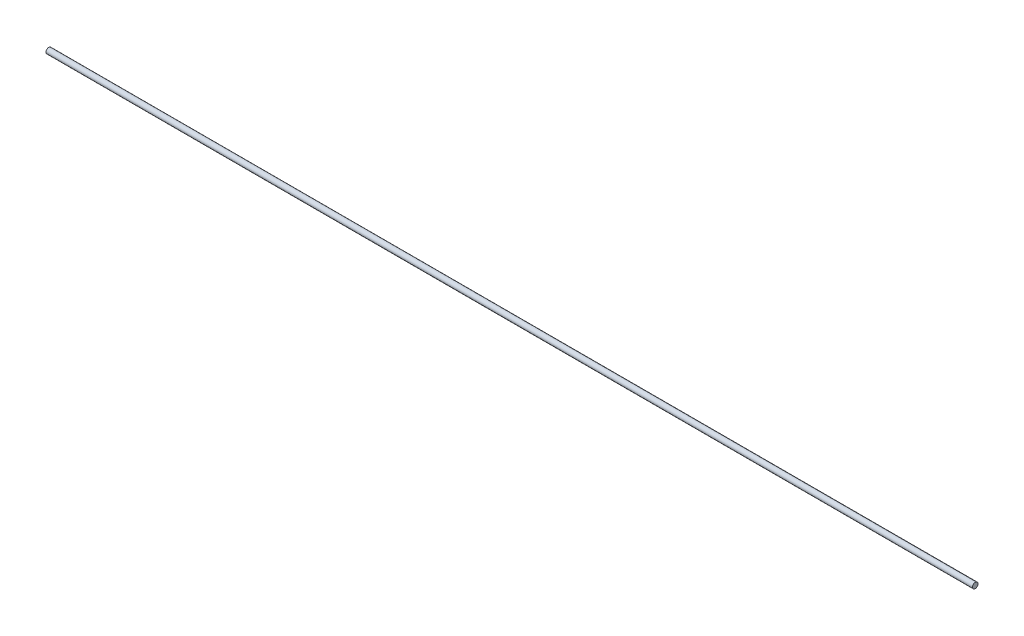
ISO-10303-21;
HEADER;
FILE_DESCRIPTION(('STEP AP214'),'2;1');
FILE_NAME('part.step','',(''),(''),'','','');
FILE_SCHEMA(('AUTOMOTIVE_DESIGN { 1 0 10303 214 1 1 1 1 }'));
ENDSEC;
DATA;
#1=APPLICATION_CONTEXT('core data for automotive mechanical design processes');
#2=APPLICATION_PROTOCOL_DEFINITION('international standard','automotive_design',2000,#1);
#3=PRODUCT_CONTEXT('',#1,'mechanical');
#4=PRODUCT('Part','Part','',(#3));
#5=PRODUCT_RELATED_PRODUCT_CATEGORY('part','',(#4));
#6=PRODUCT_DEFINITION_FORMATION('','',#4);
#7=PRODUCT_DEFINITION_CONTEXT('part definition',#1,'design');
#8=PRODUCT_DEFINITION('design','',#6,#7);
#9=PRODUCT_DEFINITION_SHAPE('','',#8);
#10=(LENGTH_UNIT() NAMED_UNIT(*) SI_UNIT(.MILLI.,.METRE.));
#11=(NAMED_UNIT(*) PLANE_ANGLE_UNIT() SI_UNIT($,.RADIAN.));
#12=(NAMED_UNIT(*) SI_UNIT($,.STERADIAN.) SOLID_ANGLE_UNIT());
#13=UNCERTAINTY_MEASURE_WITH_UNIT(LENGTH_MEASURE(1.E-05),#10,'distance_accuracy_value','');
#14=(GEOMETRIC_REPRESENTATION_CONTEXT(3) GLOBAL_UNCERTAINTY_ASSIGNED_CONTEXT((#13)) GLOBAL_UNIT_ASSIGNED_CONTEXT((#10,
#11,#12)) REPRESENTATION_CONTEXT('',''));
#15=CARTESIAN_POINT('',(0.,0.,0.));
#16=DIRECTION('',(0.,0.,1.));
#17=DIRECTION('',(1.,0.,0.));
#18=AXIS2_PLACEMENT_3D('',#15,#16,#17);
#19=CARTESIAN_POINT('',(-41.9530449994163,703.857964053837,702.882012255546));
#20=DIRECTION('',(1.,0.,0.));
#21=DIRECTION('',(0.,1.,0.));
#22=AXIS2_PLACEMENT_3D('',#19,#20,#21);
#23=PLANE('',#22);
#24=CARTESIAN_POINT('',(-41.9530449994163,703.857964053837,702.882012255546));
#25=DIRECTION('',(-1.,0.,0.));
#26=DIRECTION('',(0.,-1.,0.));
#27=AXIS2_PLACEMENT_3D('',#24,#25,#26);
#28=CIRCLE('',#27,2.05785812457876);
#29=CARTESIAN_POINT('',(-41.9530449994163,701.800105929258,702.882012255546));
#30=VERTEX_POINT('',#29);
#31=EDGE_CURVE('E17',#30,#30,#28,.F.);
#32=ORIENTED_EDGE('',*,*,#31,.F.);
#33=EDGE_LOOP('',(#32));
#34=FACE_BOUND('',#33,.T.);
#35=ADVANCED_FACE('F14',(#34),#23,.F.);
#36=CARTESIAN_POINT('',(648.046955000584,703.85796405383,702.882012255546));
#37=DIRECTION('',(1.,0.,0.));
#38=DIRECTION('',(0.,1.,0.));
#39=AXIS2_PLACEMENT_3D('',#36,#37,#38);
#40=PLANE('',#39);
#41=CARTESIAN_POINT('',(648.046955000584,703.85796405383,702.882012255546));
#42=DIRECTION('',(-1.,0.,0.));
#43=DIRECTION('',(0.,-1.,0.));
#44=AXIS2_PLACEMENT_3D('',#41,#42,#43);
#45=CIRCLE('',#44,2.05785812457876);
#46=CARTESIAN_POINT('',(648.046955000584,701.800105929251,702.882012255546));
#47=VERTEX_POINT('',#46);
#48=EDGE_CURVE('E10',#47,#47,#45,.T.);
#49=ORIENTED_EDGE('',*,*,#48,.F.);
#50=EDGE_LOOP('',(#49));
#51=FACE_BOUND('',#50,.T.);
#52=ADVANCED_FACE('F29',(#51),#40,.T.);
#53=CARTESIAN_POINT('',(648.046955000584,703.85796405383,702.882012255546));
#54=DIRECTION('',(-1.,0.,0.));
#55=DIRECTION('',(0.,-1.,0.));
#56=AXIS2_PLACEMENT_3D('',#53,#54,#55);
#57=CYLINDRICAL_SURFACE('',#56,2.05785812457876);
#58=ORIENTED_EDGE('',*,*,#48,.T.);
#59=EDGE_LOOP('',(#58));
#60=FACE_BOUND('',#59,.T.);
#61=ORIENTED_EDGE('',*,*,#31,.T.);
#62=EDGE_LOOP('',(#61));
#63=FACE_BOUND('',#62,.T.);
#64=ADVANCED_FACE('F26',(#60,#63),#57,.T.);
#65=CLOSED_SHELL('',(#35,#52,#64));
#66=MANIFOLD_SOLID_BREP('B1',#65);
#67=ADVANCED_BREP_SHAPE_REPRESENTATION('',(#18,#66),#14);
#68=SHAPE_DEFINITION_REPRESENTATION(#9,#67);
ENDSEC;
END-ISO-10303-21;
